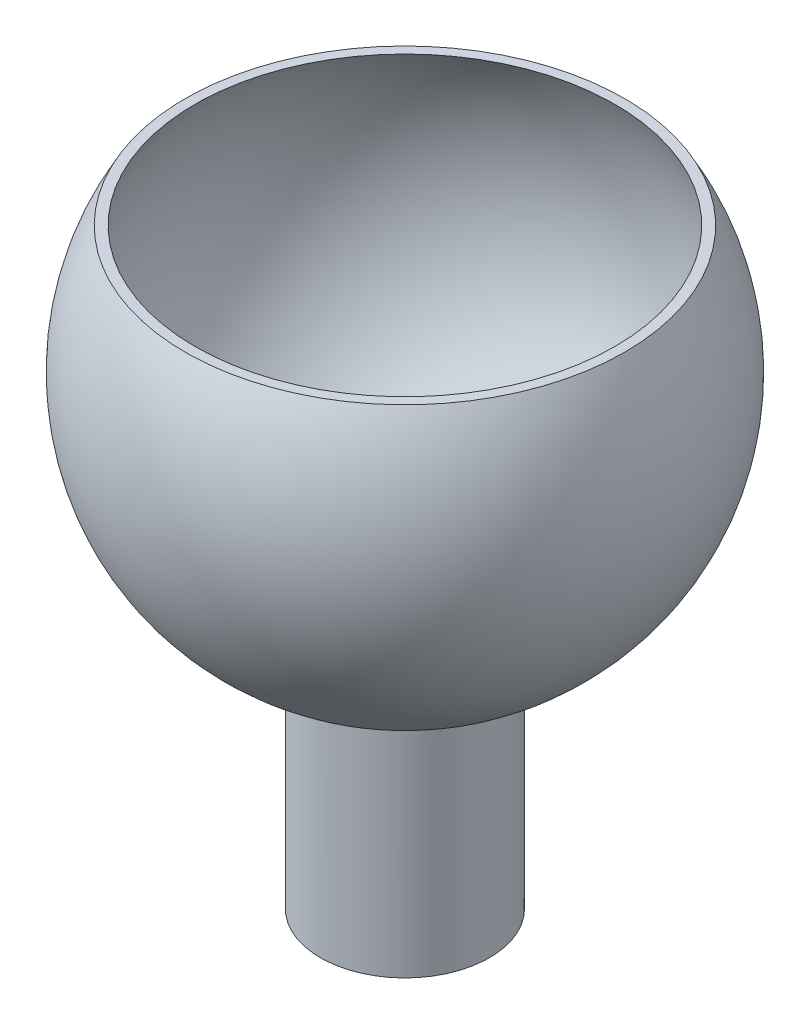
ISO-10303-21;
HEADER;
FILE_DESCRIPTION(('STEP AP214'),'2;1');
FILE_NAME('part.step','',(''),(''),'','','');
FILE_SCHEMA(('AUTOMOTIVE_DESIGN { 1 0 10303 214 1 1 1 1 }'));
ENDSEC;
DATA;
#1=APPLICATION_CONTEXT('core data for automotive mechanical design processes');
#2=APPLICATION_PROTOCOL_DEFINITION('international standard','automotive_design',2000,#1);
#3=PRODUCT_CONTEXT('',#1,'mechanical');
#4=PRODUCT('Part','Part','',(#3));
#5=PRODUCT_RELATED_PRODUCT_CATEGORY('part','',(#4));
#6=PRODUCT_DEFINITION_FORMATION('','',#4);
#7=PRODUCT_DEFINITION_CONTEXT('part definition',#1,'design');
#8=PRODUCT_DEFINITION('design','',#6,#7);
#9=PRODUCT_DEFINITION_SHAPE('','',#8);
#10=(LENGTH_UNIT() NAMED_UNIT(*) SI_UNIT(.MILLI.,.METRE.));
#11=(NAMED_UNIT(*) PLANE_ANGLE_UNIT() SI_UNIT($,.RADIAN.));
#12=(NAMED_UNIT(*) SI_UNIT($,.STERADIAN.) SOLID_ANGLE_UNIT());
#13=UNCERTAINTY_MEASURE_WITH_UNIT(LENGTH_MEASURE(1.E-05),#10,'distance_accuracy_value','');
#14=(GEOMETRIC_REPRESENTATION_CONTEXT(3) GLOBAL_UNCERTAINTY_ASSIGNED_CONTEXT((#13)) GLOBAL_UNIT_ASSIGNED_CONTEXT((#10,
#11,#12)) REPRESENTATION_CONTEXT('',''));
#15=CARTESIAN_POINT('',(0.,0.,0.));
#16=DIRECTION('',(0.,0.,1.));
#17=DIRECTION('',(1.,0.,0.));
#18=AXIS2_PLACEMENT_3D('',#15,#16,#17);
#19=CARTESIAN_POINT('',(0.,0.,0.));
#20=DIRECTION('',(0.,1.,0.));
#21=DIRECTION('',(1.,0.,0.));
#22=AXIS2_PLACEMENT_3D('',#19,#20,#21);
#23=SPHERICAL_SURFACE('',#22,30.);
#24=CARTESIAN_POINT('',(0.,15.,0.));
#25=DIRECTION('',(0.,1.,0.));
#26=DIRECTION('',(0.,0.,1.));
#27=AXIS2_PLACEMENT_3D('',#24,#25,#26);
#28=CIRCLE('',#27,25.9807621135332);
#29=CARTESIAN_POINT('',(25.9807621135332,15.,0.));
#30=VERTEX_POINT('',#29);
#31=EDGE_CURVE('E37',#30,#30,#28,.T.);
#32=CARTESIAN_POINT('',(0.,-28.2842712474619,0.));
#33=DIRECTION('',(0.,1.,0.));
#34=DIRECTION('',(-1.,0.,0.));
#35=AXIS2_PLACEMENT_3D('',#32,#33,#34);
#36=CIRCLE('',#35,10.);
#37=CARTESIAN_POINT('',(10.,-28.2842712474619,0.));
#38=VERTEX_POINT('',#37);
#39=EDGE_CURVE('E10',#38,#38,#36,.F.);
#40=CARTESIAN_POINT('',(25.9807621135332,15.,0.));
#41=CARTESIAN_POINT('',(26.2549262952127,14.5251661158263,0.));
#42=CARTESIAN_POINT('',(26.5160443797932,14.0428018426984,0.));
#43=CARTESIAN_POINT('',(27.0114671052445,13.0644944853965,0.));
#44=CARTESIAN_POINT('',(27.2457717461154,12.5685514012226,0.));
#45=CARTESIAN_POINT('',(27.6868463346357,11.5645683886915,0.));
#46=CARTESIAN_POINT('',(27.8936162822853,11.0565284603342,0.));
#47=CARTESIAN_POINT('',(28.2790045862264,10.0298810197656,0.));
#48=CARTESIAN_POINT('',(28.457622942518,9.51127350755413,0.));
#49=CARTESIAN_POINT('',(28.7861699910962,8.4650489910408,0.));
#50=CARTESIAN_POINT('',(28.9360986833828,7.93743198673892,0.));
#51=CARTESIAN_POINT('',(29.2068161104613,6.87477444160206,0.));
#52=CARTESIAN_POINT('',(29.3276048452531,6.33973390076708,0.));
#53=CARTESIAN_POINT('',(29.5396792306018,5.26383733970017,0.));
#54=CARTESIAN_POINT('',(29.6309648811585,4.72298131946823,0.));
#55=CARTESIAN_POINT('',(29.7837587561819,3.63707939194211,0.));
#56=CARTESIAN_POINT('',(29.8452669806485,3.09203348464792,0.));
#57=CARTESIAN_POINT('',(29.9383211299381,1.99938995322485,0.));
#58=CARTESIAN_POINT('',(29.969867054761,1.45179232909597,0.));
#59=CARTESIAN_POINT('',(30.0029017929787,0.355691207640887,0.));
#60=CARTESIAN_POINT('',(30.0043906063735,-0.19281228968532,0.));
#61=CARTESIAN_POINT('',(29.9773066465502,-1.28907659231718,0.));
#62=CARTESIAN_POINT('',(29.948733873332,-1.83683739762283,0.));
#63=CARTESIAN_POINT('',(29.8616126178631,-2.92996998291771,0.));
#64=CARTESIAN_POINT('',(29.8030641356124,-3.47534176290692,0.));
#65=CARTESIAN_POINT('',(29.6561674335853,-4.56205714473281,0.));
#66=CARTESIAN_POINT('',(29.5678192138089,-5.10340074656948,0.));
#67=CARTESIAN_POINT('',(29.3615885734643,-6.18043272620316,0.));
#68=CARTESIAN_POINT('',(29.2437061528962,-6.71612110400017,0.));
#69=CARTESIAN_POINT('',(28.9787614147876,-7.78023258684258,0.));
#70=CARTESIAN_POINT('',(28.8316990972471,-8.30865569188797,0.));
#71=CARTESIAN_POINT('',(28.5088365712281,-9.35664841679675,0.));
#72=CARTESIAN_POINT('',(28.3330363627496,-9.87621803666014,0.));
#73=CARTESIAN_POINT('',(27.9532264346197,-10.9049421885409,0.));
#74=CARTESIAN_POINT('',(27.7492167149684,-11.4140967205583,0.));
#75=CARTESIAN_POINT('',(27.3136009299082,-12.4204603973549,0.));
#76=CARTESIAN_POINT('',(27.0819948644994,-12.9176695421341,0.));
#77=CARTESIAN_POINT('',(26.5918824960776,-13.8986480477541,0.));
#78=CARTESIAN_POINT('',(26.3333761930646,-14.3824174085949,0.));
#79=CARTESIAN_POINT('',(25.7902403081259,-15.3350623438475,0.));
#80=CARTESIAN_POINT('',(25.5056107262002,-15.8039379182593,0.));
#81=CARTESIAN_POINT('',(24.9110837574562,-16.7253860424635,0.));
#82=CARTESIAN_POINT('',(24.6011863706379,-17.177958592256,0.));
#83=CARTESIAN_POINT('',(23.9570552102933,-18.0654404289496,0.));
#84=CARTESIAN_POINT('',(23.6228214367671,-18.5003497158508,0.));
#85=CARTESIAN_POINT('',(22.9310220658294,-19.3511978764969,0.));
#86=CARTESIAN_POINT('',(22.5734564684179,-19.7671367502418,0.));
#87=CARTESIAN_POINT('',(21.836068138201,-20.5787939518018,0.));
#88=CARTESIAN_POINT('',(21.4562454053956,-20.9745122796168,0.));
#89=CARTESIAN_POINT('',(20.6754843873288,-21.744539028586,0.));
#90=CARTESIAN_POINT('',(20.2745461020675,-22.1188474497401,0.));
#91=CARTESIAN_POINT('',(19.4527590297344,-22.8449293818909,0.));
#92=CARTESIAN_POINT('',(19.0319102426627,-23.1967028928876,0.));
#93=CARTESIAN_POINT('',(18.1715670468988,-23.8766577006061,0.));
#94=CARTESIAN_POINT('',(17.7320726382068,-24.2048389973279,0.));
#95=CARTESIAN_POINT('',(16.8357591680809,-24.8366230956013,0.));
#96=CARTESIAN_POINT('',(16.3789401066471,-25.1402258971529,0.));
#97=CARTESIAN_POINT('',(15.449350191322,-25.7219401667123,0.));
#98=CARTESIAN_POINT('',(14.9765793374308,-26.0000516347201,0.));
#99=CARTESIAN_POINT('',(14.0165073099004,-26.5299486190429,0.));
#100=CARTESIAN_POINT('',(13.5292061362612,-26.7817341353581,0.));
#101=CARTESIAN_POINT('',(12.5415361200666,-27.2582177354951,0.));
#102=CARTESIAN_POINT('',(12.0411672775111,-27.4829158193169,0.));
#103=CARTESIAN_POINT('',(11.0288731569633,-27.9045668311134,0.));
#104=CARTESIAN_POINT('',(10.516947878971,-28.101519759088,0.));
#105=CARTESIAN_POINT('',(10.,-28.2842712474619,0.));
#106=B_SPLINE_CURVE_WITH_KNOTS('',3,(#40,#41,#42,#43,#44,#45,#46,#47,#48,#49,#50,#51,#52,#53,
#54,#55,#56,#57,#58,#59,#60,#61,#62,#63,#64,#65,#66,#67,#68,#69,#70,#71,#72,#73,#74,#75,#76,#77,
#78,#79,#80,#81,#82,#83,#84,#85,#86,#87,#88,#89,#90,#91,#92,#93,#94,#95,#96,#97,#98,#99,#100,
#101,#102,#103,#104,#105),.UNSPECIFIED.,.F.,.F.,(4,2,2,2,2,2,2,2,2,2,2,2,2,2,2,2,2,2,2,2,2,2,2,
2,2,2,2,2,2,2,2,2,4),(0.,1.64469226799289,3.28938453598578,4.93407680397867,6.57876907197155,
8.22346133996444,9.86815360795733,11.5128458759502,13.1575381439431,14.802230411936,
16.4469226799289,18.0916149479218,19.7363072159147,21.3809994839076,23.0256917519004,
24.6703840198933,26.3150762878862,27.9597685558791,29.604460823872,31.2491530918649,
32.8938453598578,34.5385376278507,36.1832298958436,37.8279221638364,39.4726144318293,
41.1173066998222,42.7619989678151,44.406691235808,46.0513835038009,47.6960757717938,
49.3407680397867,50.9854603077796,52.6301525757724),.UNSPECIFIED.);
#107=EDGE_CURVE('BSEAM31',#30,#38,#106,.T.);
#108=ORIENTED_EDGE('',*,*,#31,.F.);
#109=ORIENTED_EDGE('',*,*,#39,.F.);
#110=ORIENTED_EDGE('',*,*,#107,.T.);
#111=ORIENTED_EDGE('',*,*,#107,.F.);
#112=EDGE_LOOP('',(#108,#110,#109,#111));
#113=FACE_BOUND('',#112,.T.);
#114=ADVANCED_FACE('F31',(#113),#23,.T.);
#115=CARTESIAN_POINT('',(-39.041394335512,15.,129.903810567666));
#116=DIRECTION('',(0.,1.,0.));
#117=DIRECTION('',(0.,0.,1.));
#118=AXIS2_PLACEMENT_3D('',#115,#116,#117);
#119=PLANE('',#118);
#120=CARTESIAN_POINT('',(0.,15.,0.));
#121=DIRECTION('',(0.,1.,0.));
#122=DIRECTION('',(0.,0.,1.));
#123=AXIS2_PLACEMENT_3D('',#120,#121,#122);
#124=CIRCLE('',#123,24.8193472919817);
#125=CARTESIAN_POINT('',(0.,15.,24.8193472919817));
#126=VERTEX_POINT('',#125);
#127=EDGE_CURVE('E41',#126,#126,#124,.T.);
#128=ORIENTED_EDGE('',*,*,#127,.F.);
#129=EDGE_LOOP('',(#128));
#130=FACE_BOUND('',#129,.T.);
#131=ORIENTED_EDGE('',*,*,#31,.T.);
#132=EDGE_LOOP('',(#131));
#133=FACE_BOUND('',#132,.T.);
#134=ADVANCED_FACE('F62',(#130,#133),#119,.T.);
#135=CARTESIAN_POINT('',(0.,0.,0.));
#136=DIRECTION('',(0.,1.,0.));
#137=DIRECTION('',(1.,0.,0.));
#138=AXIS2_PLACEMENT_3D('',#135,#136,#137);
#139=SPHERICAL_SURFACE('',#138,29.);
#140=ORIENTED_EDGE('',*,*,#127,.T.);
#141=EDGE_LOOP('',(#140));
#142=FACE_BOUND('',#141,.T.);
#143=ADVANCED_FACE('F55',(#142),#139,.F.);
#144=CARTESIAN_POINT('',(0.,-55.,0.));
#145=DIRECTION('',(0.,1.,0.));
#146=DIRECTION('',(-1.,0.,0.));
#147=AXIS2_PLACEMENT_3D('',#144,#145,#146);
#148=PLANE('',#147);
#149=CARTESIAN_POINT('',(0.,-55.,0.));
#150=DIRECTION('',(0.,1.,0.));
#151=DIRECTION('',(-1.,0.,0.));
#152=AXIS2_PLACEMENT_3D('',#149,#150,#151);
#153=CIRCLE('',#152,10.);
#154=CARTESIAN_POINT('',(-10.,-55.,0.));
#155=VERTEX_POINT('',#154);
#156=EDGE_CURVE('E45',#155,#155,#153,.T.);
#157=ORIENTED_EDGE('',*,*,#156,.F.);
#158=EDGE_LOOP('',(#157));
#159=FACE_BOUND('',#158,.T.);
#160=ADVANCED_FACE('F53',(#159),#148,.F.);
#161=CARTESIAN_POINT('',(0.,-30.,0.));
#162=DIRECTION('',(0.,1.,0.));
#163=DIRECTION('',(-1.,0.,0.));
#164=AXIS2_PLACEMENT_3D('',#161,#162,#163);
#165=CYLINDRICAL_SURFACE('',#164,10.);
#166=ORIENTED_EDGE('',*,*,#39,.T.);
#167=EDGE_LOOP('',(#166));
#168=FACE_BOUND('',#167,.T.);
#169=ORIENTED_EDGE('',*,*,#156,.T.);
#170=EDGE_LOOP('',(#169));
#171=FACE_BOUND('',#170,.T.);
#172=ADVANCED_FACE('F51',(#168,#171),#165,.T.);
#173=CLOSED_SHELL('',(#114,#134,#143,#160,#172));
#174=MANIFOLD_SOLID_BREP('B2',#173);
#175=ADVANCED_BREP_SHAPE_REPRESENTATION('',(#18,#174),#14);
#176=SHAPE_DEFINITION_REPRESENTATION(#9,#175);
ENDSEC;
END-ISO-10303-21;
